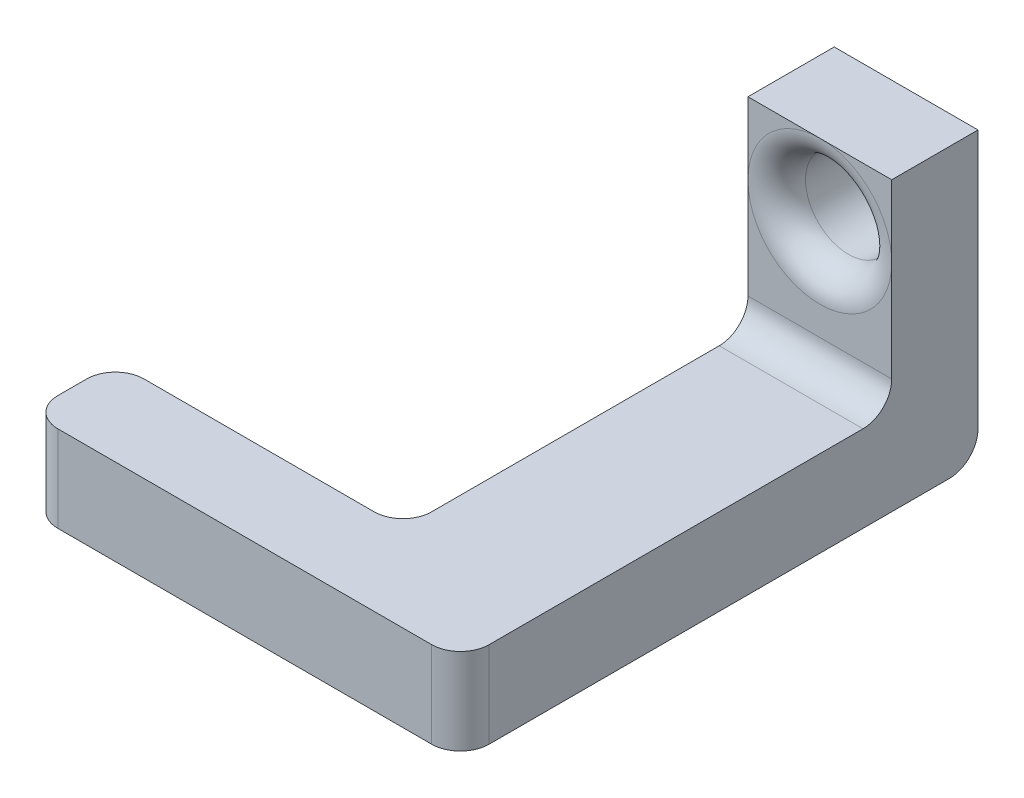
ISO-10303-21;
HEADER;
FILE_DESCRIPTION(('STEP AP214'),'2;1');
FILE_NAME('part.step','',(''),(''),'','','');
FILE_SCHEMA(('AUTOMOTIVE_DESIGN { 1 0 10303 214 1 1 1 1 }'));
ENDSEC;
DATA;
#1=APPLICATION_CONTEXT('core data for automotive mechanical design processes');
#2=APPLICATION_PROTOCOL_DEFINITION('international standard','automotive_design',2000,#1);
#3=PRODUCT_CONTEXT('',#1,'mechanical');
#4=PRODUCT('Part','Part','',(#3));
#5=PRODUCT_RELATED_PRODUCT_CATEGORY('part','',(#4));
#6=PRODUCT_DEFINITION_FORMATION('','',#4);
#7=PRODUCT_DEFINITION_CONTEXT('part definition',#1,'design');
#8=PRODUCT_DEFINITION('design','',#6,#7);
#9=PRODUCT_DEFINITION_SHAPE('','',#8);
#10=(LENGTH_UNIT() NAMED_UNIT(*) SI_UNIT(.MILLI.,.METRE.));
#11=(NAMED_UNIT(*) PLANE_ANGLE_UNIT() SI_UNIT($,.RADIAN.));
#12=(NAMED_UNIT(*) SI_UNIT($,.STERADIAN.) SOLID_ANGLE_UNIT());
#13=UNCERTAINTY_MEASURE_WITH_UNIT(LENGTH_MEASURE(1.E-05),#10,'distance_accuracy_value','');
#14=(GEOMETRIC_REPRESENTATION_CONTEXT(3) GLOBAL_UNCERTAINTY_ASSIGNED_CONTEXT((#13)) GLOBAL_UNIT_ASSIGNED_CONTEXT((#10,
#11,#12)) REPRESENTATION_CONTEXT('',''));
#15=CARTESIAN_POINT('',(0.,0.,0.));
#16=DIRECTION('',(0.,0.,1.));
#17=DIRECTION('',(1.,0.,0.));
#18=AXIS2_PLACEMENT_3D('',#15,#16,#17);
#19=CARTESIAN_POINT('',(0.,0.,3.));
#20=DIRECTION('',(0.,0.,1.));
#21=DIRECTION('',(1.,0.,0.));
#22=AXIS2_PLACEMENT_3D('',#19,#20,#21);
#23=PLANE('',#22);
#24=DIRECTION('',(0.,-1.,0.));
#25=VECTOR('',#24,1.);
#26=CARTESIAN_POINT('',(-6.90104166666667,8.82812499999999,3.));
#27=LINE('',#26,#25);
#28=CARTESIAN_POINT('',(-6.90104166666667,6.32812499999999,3.));
#29=VERTEX_POINT('',#28);
#30=CARTESIAN_POINT('',(-6.90104166666667,2.82812499999999,3.));
#31=VERTEX_POINT('',#30);
#32=EDGE_CURVE('E183',#29,#31,#27,.T.);
#33=ORIENTED_EDGE('',*,*,#32,.T.);
#34=DIRECTION('',(-1.,0.,0.));
#35=VECTOR('',#34,1.);
#36=CARTESIAN_POINT('',(0.,2.82812499999999,3.));
#37=LINE('',#36,#35);
#38=CARTESIAN_POINT('',(-1.90104166666667,2.82812499999999,3.));
#39=VERTEX_POINT('',#38);
#40=EDGE_CURVE('E54',#31,#39,#37,.F.);
#41=ORIENTED_EDGE('',*,*,#40,.T.);
#42=DIRECTION('',(0.,1.,0.));
#43=VECTOR('',#42,1.);
#44=CARTESIAN_POINT('',(-1.90104166666667,8.82812499999999,3.));
#45=LINE('',#44,#43);
#46=CARTESIAN_POINT('',(-1.90104166666667,6.32812499999999,3.));
#47=VERTEX_POINT('',#46);
#48=EDGE_CURVE('E152',#39,#47,#45,.T.);
#49=ORIENTED_EDGE('',*,*,#48,.T.);
#50=CARTESIAN_POINT('',(-4.40104166666667,6.32812499999999,3.));
#51=DIRECTION('',(0.,0.,1.));
#52=DIRECTION('',(1.,0.,0.));
#53=AXIS2_PLACEMENT_3D('',#50,#51,#52);
#54=CIRCLE('',#53,2.5);
#55=EDGE_CURVE('E480',#47,#29,#54,.F.);
#56=ORIENTED_EDGE('',*,*,#55,.T.);
#57=EDGE_LOOP('',(#33,#41,#49,#56));
#58=FACE_BOUND('',#57,.T.);
#59=ADVANCED_FACE('F33',(#58),#23,.T.);
#60=CARTESIAN_POINT('',(-6.90104166666667,8.82812499999999,3.));
#61=VERTEX_POINT('',#60);
#62=EDGE_CURVE('E153',#61,#29,#27,.T.);
#63=ORIENTED_EDGE('',*,*,#62,.T.);
#64=CARTESIAN_POINT('',(-4.40104166666667,6.32812499999999,3.));
#65=DIRECTION('',(0.,0.,1.));
#66=DIRECTION('',(1.,0.,0.));
#67=AXIS2_PLACEMENT_3D('',#64,#65,#66);
#68=CIRCLE('',#67,2.5);
#69=CARTESIAN_POINT('',(-4.40104166666667,8.82812499999999,3.));
#70=VERTEX_POINT('',#69);
#71=EDGE_CURVE('E482',#29,#70,#68,.F.);
#72=ORIENTED_EDGE('',*,*,#71,.T.);
#73=DIRECTION('',(-1.,0.,0.));
#74=VECTOR('',#73,1.);
#75=CARTESIAN_POINT('',(-6.90104166666667,8.82812499999999,3.));
#76=LINE('',#75,#74);
#77=EDGE_CURVE('E169',#70,#61,#76,.T.);
#78=ORIENTED_EDGE('',*,*,#77,.T.);
#79=EDGE_LOOP('',(#63,#72,#78));
#80=FACE_BOUND('',#79,.T.);
#81=ADVANCED_FACE('F311',(#80),#23,.T.);
#82=CARTESIAN_POINT('',(-6.90104166666667,8.82812499999999,3.));
#83=DIRECTION('',(1.,0.,0.));
#84=DIRECTION('',(0.,1.,0.));
#85=AXIS2_PLACEMENT_3D('',#82,#83,#84);
#86=PLANE('',#85);
#87=DIRECTION('',(0.,-1.,0.));
#88=VECTOR('',#87,1.);
#89=CARTESIAN_POINT('',(-6.90104166666667,8.82812499999999,0.));
#90=LINE('',#89,#88);
#91=CARTESIAN_POINT('',(-6.90104166666667,8.82812499999999,0.));
#92=VERTEX_POINT('',#91);
#93=CARTESIAN_POINT('',(-6.90104166666667,-0.171875000000009,0.));
#94=VERTEX_POINT('',#93);
#95=EDGE_CURVE('E177',#92,#94,#90,.T.);
#96=ORIENTED_EDGE('',*,*,#95,.T.);
#97=CARTESIAN_POINT('',(-6.90104166666667,-0.171875000000008,1.));
#98=DIRECTION('',(1.,0.,0.));
#99=DIRECTION('',(0.,1.,0.));
#100=AXIS2_PLACEMENT_3D('',#97,#98,#99);
#101=CIRCLE('',#100,1.);
#102=CARTESIAN_POINT('',(-6.90104166666667,-1.17187500000001,1.));
#103=VERTEX_POINT('',#102);
#104=EDGE_CURVE('E472',#94,#103,#101,.F.);
#105=ORIENTED_EDGE('',*,*,#104,.T.);
#106=DIRECTION('',(0.,0.,-1.));
#107=VECTOR('',#106,1.);
#108=CARTESIAN_POINT('',(-6.90104166666667,-1.17187500000001,3.));
#109=LINE('',#108,#107);
#110=CARTESIAN_POINT('',(-6.90104166666667,-1.17187500000001,14.));
#111=VERTEX_POINT('',#110);
#112=EDGE_CURVE('E186',#111,#103,#109,.T.);
#113=ORIENTED_EDGE('',*,*,#112,.F.);
#114=DIRECTION('',(0.,-1.,0.));
#115=VECTOR('',#114,1.);
#116=CARTESIAN_POINT('',(-6.90104166666667,1.82812499999999,14.));
#117=LINE('',#116,#115);
#118=CARTESIAN_POINT('',(-6.90104166666667,1.82812499999999,14.));
#119=VERTEX_POINT('',#118);
#120=EDGE_CURVE('E197',#111,#119,#117,.F.);
#121=ORIENTED_EDGE('',*,*,#120,.T.);
#122=DIRECTION('',(0.,0.,-1.));
#123=VECTOR('',#122,1.);
#124=CARTESIAN_POINT('',(-6.90104166666667,1.82812499999999,18.));
#125=LINE('',#124,#123);
#126=CARTESIAN_POINT('',(-6.90104166666667,1.82812499999999,4.));
#127=VERTEX_POINT('',#126);
#128=EDGE_CURVE('E195',#119,#127,#125,.T.);
#129=ORIENTED_EDGE('',*,*,#128,.T.);
#130=CARTESIAN_POINT('',(-6.90104166666667,2.82812499999999,4.));
#131=DIRECTION('',(1.,0.,0.));
#132=DIRECTION('',(0.,1.,0.));
#133=AXIS2_PLACEMENT_3D('',#130,#131,#132);
#134=CIRCLE('',#133,1.);
#135=EDGE_CURVE('E41',#127,#31,#134,.T.);
#136=ORIENTED_EDGE('',*,*,#135,.T.);
#137=ORIENTED_EDGE('',*,*,#32,.F.);
#138=ORIENTED_EDGE('',*,*,#62,.F.);
#139=DIRECTION('',(0.,0.,-1.));
#140=VECTOR('',#139,1.);
#141=CARTESIAN_POINT('',(-6.90104166666667,8.82812499999999,3.));
#142=LINE('',#141,#140);
#143=EDGE_CURVE('E164',#61,#92,#142,.T.);
#144=ORIENTED_EDGE('',*,*,#143,.T.);
#145=EDGE_LOOP('',(#96,#105,#113,#121,#129,#136,#137,#138,#144));
#146=FACE_BOUND('',#145,.T.);
#147=ADVANCED_FACE('F316',(#146),#86,.F.);
#148=CARTESIAN_POINT('',(-1.90104166666667,8.82812499999999,3.));
#149=VERTEX_POINT('',#148);
#150=EDGE_CURVE('E147',#149,#70,#76,.T.);
#151=ORIENTED_EDGE('',*,*,#150,.T.);
#152=CARTESIAN_POINT('',(-4.40104166666667,6.32812499999999,3.));
#153=DIRECTION('',(0.,0.,1.));
#154=DIRECTION('',(1.,0.,0.));
#155=AXIS2_PLACEMENT_3D('',#152,#153,#154);
#156=CIRCLE('',#155,2.5);
#157=EDGE_CURVE('E149',#70,#47,#156,.F.);
#158=ORIENTED_EDGE('',*,*,#157,.T.);
#159=EDGE_CURVE('E143',#47,#149,#45,.T.);
#160=ORIENTED_EDGE('',*,*,#159,.T.);
#161=EDGE_LOOP('',(#151,#158,#160));
#162=FACE_BOUND('',#161,.T.);
#163=ADVANCED_FACE('F145',(#162),#23,.T.);
#164=CARTESIAN_POINT('',(0.,0.,0.));
#165=DIRECTION('',(0.,0.,1.));
#166=DIRECTION('',(1.,0.,0.));
#167=AXIS2_PLACEMENT_3D('',#164,#165,#166);
#168=PLANE('',#167);
#169=DIRECTION('',(0.,1.,0.));
#170=VECTOR('',#169,1.);
#171=CARTESIAN_POINT('',(-1.90104166666667,8.82812499999999,0.));
#172=LINE('',#171,#170);
#173=CARTESIAN_POINT('',(-1.90104166666667,-0.171875000000009,0.));
#174=VERTEX_POINT('',#173);
#175=CARTESIAN_POINT('',(-1.90104166666667,8.82812499999999,0.));
#176=VERTEX_POINT('',#175);
#177=EDGE_CURVE('E160',#174,#176,#172,.T.);
#178=ORIENTED_EDGE('',*,*,#177,.F.);
#179=DIRECTION('',(1.,0.,0.));
#180=VECTOR('',#179,1.);
#181=CARTESIAN_POINT('',(0.,-0.171875000000008,0.));
#182=LINE('',#181,#180);
#183=EDGE_CURVE('E475',#174,#94,#182,.F.);
#184=ORIENTED_EDGE('',*,*,#183,.T.);
#185=ORIENTED_EDGE('',*,*,#95,.F.);
#186=DIRECTION('',(-1.,0.,0.));
#187=VECTOR('',#186,1.);
#188=CARTESIAN_POINT('',(-6.90104166666667,8.82812499999999,0.));
#189=LINE('',#188,#187);
#190=EDGE_CURVE('E182',#176,#92,#189,.T.);
#191=ORIENTED_EDGE('',*,*,#190,.F.);
#192=EDGE_LOOP('',(#178,#184,#185,#191));
#193=FACE_BOUND('',#192,.T.);
#194=CARTESIAN_POINT('',(-4.40104166666667,6.32812499999999,0.));
#195=DIRECTION('',(0.,0.,1.));
#196=DIRECTION('',(1.,0.,0.));
#197=AXIS2_PLACEMENT_3D('',#194,#195,#196);
#198=CIRCLE('',#197,1.5);
#199=CARTESIAN_POINT('',(-2.90104166666667,6.32812499999999,0.));
#200=VERTEX_POINT('',#199);
#201=EDGE_CURVE('E180',#200,#200,#198,.T.);
#202=ORIENTED_EDGE('',*,*,#201,.T.);
#203=EDGE_LOOP('',(#202));
#204=FACE_BOUND('',#203,.T.);
#205=ADVANCED_FACE('F321',(#193,#204),#168,.F.);
#206=CARTESIAN_POINT('',(-6.90104166666667,-1.17187500000001,3.));
#207=DIRECTION('',(0.,1.,0.));
#208=DIRECTION('',(0.,0.,1.));
#209=AXIS2_PLACEMENT_3D('',#206,#207,#208);
#210=PLANE('',#209);
#211=ORIENTED_EDGE('',*,*,#112,.T.);
#212=DIRECTION('',(1.,0.,0.));
#213=VECTOR('',#212,1.);
#214=CARTESIAN_POINT('',(-6.90104166666667,-1.17187500000001,1.));
#215=LINE('',#214,#213);
#216=CARTESIAN_POINT('',(-1.90104166666667,-1.17187500000001,1.));
#217=VERTEX_POINT('',#216);
#218=EDGE_CURVE('E481',#103,#217,#215,.T.);
#219=ORIENTED_EDGE('',*,*,#218,.T.);
#220=DIRECTION('',(0.,0.,-1.));
#221=VECTOR('',#220,1.);
#222=CARTESIAN_POINT('',(-1.90104166666667,-1.17187500000001,3.));
#223=LINE('',#222,#221);
#224=CARTESIAN_POINT('',(-1.90104166666667,-1.17187500000001,17.));
#225=VERTEX_POINT('',#224);
#226=EDGE_CURVE('E163',#225,#217,#223,.T.);
#227=ORIENTED_EDGE('',*,*,#226,.F.);
#228=CARTESIAN_POINT('',(-2.90104166666667,-1.17187500000001,17.));
#229=DIRECTION('',(0.,1.,0.));
#230=DIRECTION('',(0.,0.,1.));
#231=AXIS2_PLACEMENT_3D('',#228,#229,#230);
#232=CIRCLE('',#231,1.);
#233=CARTESIAN_POINT('',(-2.90104166666667,-1.17187500000001,18.));
#234=VERTEX_POINT('',#233);
#235=EDGE_CURVE('E276',#225,#234,#232,.F.);
#236=ORIENTED_EDGE('',*,*,#235,.T.);
#237=DIRECTION('',(1.,0.,0.));
#238=VECTOR('',#237,1.);
#239=CARTESIAN_POINT('',(-6.90104166666667,-1.17187500000001,18.));
#240=LINE('',#239,#238);
#241=CARTESIAN_POINT('',(-15.9010416666667,-1.17187500000001,18.));
#242=VERTEX_POINT('',#241);
#243=EDGE_CURVE('E231',#242,#234,#240,.T.);
#244=ORIENTED_EDGE('',*,*,#243,.F.);
#245=CARTESIAN_POINT('',(-15.9010416666667,-1.17187500000001,17.));
#246=DIRECTION('',(0.,1.,0.));
#247=DIRECTION('',(0.,0.,1.));
#248=AXIS2_PLACEMENT_3D('',#245,#246,#247);
#249=CIRCLE('',#248,1.);
#250=CARTESIAN_POINT('',(-16.9010416666667,-1.17187500000001,17.));
#251=VERTEX_POINT('',#250);
#252=EDGE_CURVE('E243',#242,#251,#249,.F.);
#253=ORIENTED_EDGE('',*,*,#252,.T.);
#254=DIRECTION('',(0.,0.,1.));
#255=VECTOR('',#254,1.);
#256=CARTESIAN_POINT('',(-16.9010416666667,-1.17187500000001,18.));
#257=LINE('',#256,#255);
#258=CARTESIAN_POINT('',(-16.9010416666667,-1.17187500000001,16.));
#259=VERTEX_POINT('',#258);
#260=EDGE_CURVE('E224',#259,#251,#257,.T.);
#261=ORIENTED_EDGE('',*,*,#260,.F.);
#262=CARTESIAN_POINT('',(-15.9010416666667,-1.17187500000001,16.));
#263=DIRECTION('',(0.,1.,0.));
#264=DIRECTION('',(0.,0.,1.));
#265=AXIS2_PLACEMENT_3D('',#262,#263,#264);
#266=CIRCLE('',#265,1.);
#267=CARTESIAN_POINT('',(-15.9010416666667,-1.17187500000001,15.));
#268=VERTEX_POINT('',#267);
#269=EDGE_CURVE('E227',#259,#268,#266,.F.);
#270=ORIENTED_EDGE('',*,*,#269,.T.);
#271=DIRECTION('',(1.,0.,0.));
#272=VECTOR('',#271,1.);
#273=CARTESIAN_POINT('',(-16.9010416666667,-1.17187500000001,15.));
#274=LINE('',#273,#272);
#275=CARTESIAN_POINT('',(-7.90104166666667,-1.17187500000001,15.));
#276=VERTEX_POINT('',#275);
#277=EDGE_CURVE('E220',#268,#276,#274,.T.);
#278=ORIENTED_EDGE('',*,*,#277,.T.);
#279=CARTESIAN_POINT('',(-7.90104166666667,-1.17187500000001,14.));
#280=DIRECTION('',(0.,1.,0.));
#281=DIRECTION('',(0.,0.,1.));
#282=AXIS2_PLACEMENT_3D('',#279,#280,#281);
#283=CIRCLE('',#282,1.);
#284=EDGE_CURVE('E199',#276,#111,#283,.T.);
#285=ORIENTED_EDGE('',*,*,#284,.T.);
#286=EDGE_LOOP('',(#211,#219,#227,#236,#244,#253,#261,#270,#278,#285));
#287=FACE_BOUND('',#286,.T.);
#288=ADVANCED_FACE('F296',(#287),#210,.F.);
#289=CARTESIAN_POINT('',(-1.90104166666667,8.82812499999999,3.));
#290=DIRECTION('',(-1.,0.,0.));
#291=DIRECTION('',(0.,-1.,0.));
#292=AXIS2_PLACEMENT_3D('',#289,#290,#291);
#293=PLANE('',#292);
#294=ORIENTED_EDGE('',*,*,#226,.T.);
#295=CARTESIAN_POINT('',(-1.90104166666667,-0.171875000000008,1.));
#296=DIRECTION('',(-1.,0.,0.));
#297=DIRECTION('',(0.,-1.,0.));
#298=AXIS2_PLACEMENT_3D('',#295,#296,#297);
#299=CIRCLE('',#298,1.);
#300=EDGE_CURVE('E490',#217,#174,#299,.F.);
#301=ORIENTED_EDGE('',*,*,#300,.T.);
#302=ORIENTED_EDGE('',*,*,#177,.T.);
#303=DIRECTION('',(0.,0.,-1.));
#304=VECTOR('',#303,1.);
#305=CARTESIAN_POINT('',(-1.90104166666667,8.82812499999999,3.));
#306=LINE('',#305,#304);
#307=EDGE_CURVE('E156',#149,#176,#306,.T.);
#308=ORIENTED_EDGE('',*,*,#307,.F.);
#309=ORIENTED_EDGE('',*,*,#159,.F.);
#310=ORIENTED_EDGE('',*,*,#48,.F.);
#311=CARTESIAN_POINT('',(-1.90104166666667,2.82812499999999,4.));
#312=DIRECTION('',(-1.,0.,0.));
#313=DIRECTION('',(0.,-1.,0.));
#314=AXIS2_PLACEMENT_3D('',#311,#312,#313);
#315=CIRCLE('',#314,1.);
#316=CARTESIAN_POINT('',(-1.90104166666667,1.82812499999999,4.));
#317=VERTEX_POINT('',#316);
#318=EDGE_CURVE('E11',#39,#317,#315,.T.);
#319=ORIENTED_EDGE('',*,*,#318,.T.);
#320=DIRECTION('',(0.,0.,-1.));
#321=VECTOR('',#320,1.);
#322=CARTESIAN_POINT('',(-1.90104166666667,1.82812499999999,18.));
#323=LINE('',#322,#321);
#324=CARTESIAN_POINT('',(-1.90104166666667,1.82812499999999,17.));
#325=VERTEX_POINT('',#324);
#326=EDGE_CURVE('E208',#325,#317,#323,.T.);
#327=ORIENTED_EDGE('',*,*,#326,.F.);
#328=DIRECTION('',(0.,1.,0.));
#329=VECTOR('',#328,1.);
#330=CARTESIAN_POINT('',(-1.90104166666667,8.82812499999999,17.));
#331=LINE('',#330,#329);
#332=EDGE_CURVE('E278',#325,#225,#331,.F.);
#333=ORIENTED_EDGE('',*,*,#332,.T.);
#334=EDGE_LOOP('',(#294,#301,#302,#308,#309,#310,#319,#327,#333));
#335=FACE_BOUND('',#334,.T.);
#336=ADVANCED_FACE('F158',(#335),#293,.F.);
#337=CARTESIAN_POINT('',(-6.90104166666667,8.82812499999999,3.));
#338=DIRECTION('',(0.,-1.,0.));
#339=DIRECTION('',(0.,0.,-1.));
#340=AXIS2_PLACEMENT_3D('',#337,#338,#339);
#341=PLANE('',#340);
#342=ORIENTED_EDGE('',*,*,#190,.T.);
#343=ORIENTED_EDGE('',*,*,#143,.F.);
#344=ORIENTED_EDGE('',*,*,#77,.F.);
#345=ORIENTED_EDGE('',*,*,#150,.F.);
#346=ORIENTED_EDGE('',*,*,#307,.T.);
#347=EDGE_LOOP('',(#342,#343,#344,#345,#346));
#348=FACE_BOUND('',#347,.T.);
#349=ADVANCED_FACE('F167',(#348),#341,.F.);
#350=CARTESIAN_POINT('',(-4.40104166666667,6.32812499999999,3.));
#351=DIRECTION('',(0.,0.,-1.));
#352=DIRECTION('',(-1.,0.,0.));
#353=AXIS2_PLACEMENT_3D('',#350,#351,#352);
#354=CYLINDRICAL_SURFACE('',#353,1.5);
#355=CARTESIAN_POINT('',(-4.40104166666667,6.32812499999999,2.));
#356=DIRECTION('',(0.,0.,1.));
#357=DIRECTION('',(1.,0.,0.));
#358=AXIS2_PLACEMENT_3D('',#355,#356,#357);
#359=CIRCLE('',#358,1.5);
#360=CARTESIAN_POINT('',(-2.90104166666667,6.32812499999999,2.));
#361=VERTEX_POINT('',#360);
#362=EDGE_CURVE('E245',#361,#361,#359,.T.);
#363=ORIENTED_EDGE('',*,*,#362,.T.);
#364=EDGE_LOOP('',(#363));
#365=FACE_BOUND('',#364,.T.);
#366=ORIENTED_EDGE('',*,*,#201,.F.);
#367=EDGE_LOOP('',(#366));
#368=FACE_BOUND('',#367,.T.);
#369=ADVANCED_FACE('F396',(#365,#368),#354,.F.);
#370=CARTESIAN_POINT('',(-6.90104166666667,1.82812499999999,18.));
#371=DIRECTION('',(0.,-1.,0.));
#372=DIRECTION('',(0.,0.,-1.));
#373=AXIS2_PLACEMENT_3D('',#370,#371,#372);
#374=PLANE('',#373);
#375=ORIENTED_EDGE('',*,*,#326,.T.);
#376=DIRECTION('',(-1.,0.,0.));
#377=VECTOR('',#376,1.);
#378=CARTESIAN_POINT('',(-6.90104166666667,1.82812499999999,4.));
#379=LINE('',#378,#377);
#380=EDGE_CURVE('E470',#317,#127,#379,.T.);
#381=ORIENTED_EDGE('',*,*,#380,.T.);
#382=ORIENTED_EDGE('',*,*,#128,.F.);
#383=CARTESIAN_POINT('',(-7.90104166666667,1.82812499999999,14.));
#384=DIRECTION('',(0.,-1.,0.));
#385=DIRECTION('',(0.,0.,-1.));
#386=AXIS2_PLACEMENT_3D('',#383,#384,#385);
#387=CIRCLE('',#386,1.);
#388=CARTESIAN_POINT('',(-7.90104166666667,1.82812499999999,15.));
#389=VERTEX_POINT('',#388);
#390=EDGE_CURVE('E201',#119,#389,#387,.T.);
#391=ORIENTED_EDGE('',*,*,#390,.T.);
#392=DIRECTION('',(1.,0.,0.));
#393=VECTOR('',#392,1.);
#394=CARTESIAN_POINT('',(-16.9010416666667,1.82812499999999,15.));
#395=LINE('',#394,#393);
#396=CARTESIAN_POINT('',(-15.9010416666667,1.82812499999999,15.));
#397=VERTEX_POINT('',#396);
#398=EDGE_CURVE('E223',#397,#389,#395,.T.);
#399=ORIENTED_EDGE('',*,*,#398,.F.);
#400=CARTESIAN_POINT('',(-15.9010416666667,1.82812499999999,16.));
#401=DIRECTION('',(0.,-1.,0.));
#402=DIRECTION('',(0.,0.,-1.));
#403=AXIS2_PLACEMENT_3D('',#400,#401,#402);
#404=CIRCLE('',#403,1.);
#405=CARTESIAN_POINT('',(-16.9010416666667,1.82812499999999,16.));
#406=VERTEX_POINT('',#405);
#407=EDGE_CURVE('E233',#397,#406,#404,.F.);
#408=ORIENTED_EDGE('',*,*,#407,.T.);
#409=DIRECTION('',(0.,0.,-1.));
#410=VECTOR('',#409,1.);
#411=CARTESIAN_POINT('',(-16.9010416666667,1.82812499999999,18.));
#412=LINE('',#411,#410);
#413=CARTESIAN_POINT('',(-16.9010416666667,1.82812499999999,17.));
#414=VERTEX_POINT('',#413);
#415=EDGE_CURVE('E261',#414,#406,#412,.T.);
#416=ORIENTED_EDGE('',*,*,#415,.F.);
#417=CARTESIAN_POINT('',(-15.9010416666667,1.82812499999999,17.));
#418=DIRECTION('',(0.,-1.,0.));
#419=DIRECTION('',(0.,0.,-1.));
#420=AXIS2_PLACEMENT_3D('',#417,#418,#419);
#421=CIRCLE('',#420,1.);
#422=CARTESIAN_POINT('',(-15.9010416666667,1.82812499999999,18.));
#423=VERTEX_POINT('',#422);
#424=EDGE_CURVE('E239',#414,#423,#421,.F.);
#425=ORIENTED_EDGE('',*,*,#424,.T.);
#426=DIRECTION('',(-1.,0.,0.));
#427=VECTOR('',#426,1.);
#428=CARTESIAN_POINT('',(-6.90104166666667,1.82812499999999,18.));
#429=LINE('',#428,#427);
#430=CARTESIAN_POINT('',(-2.90104166666667,1.82812499999999,18.));
#431=VERTEX_POINT('',#430);
#432=EDGE_CURVE('E255',#431,#423,#429,.T.);
#433=ORIENTED_EDGE('',*,*,#432,.F.);
#434=CARTESIAN_POINT('',(-2.90104166666667,1.82812499999999,17.));
#435=DIRECTION('',(0.,-1.,0.));
#436=DIRECTION('',(0.,0.,-1.));
#437=AXIS2_PLACEMENT_3D('',#434,#435,#436);
#438=CIRCLE('',#437,1.);
#439=EDGE_CURVE('E207',#431,#325,#438,.F.);
#440=ORIENTED_EDGE('',*,*,#439,.T.);
#441=EDGE_LOOP('',(#375,#381,#382,#391,#399,#408,#416,#425,#433,#440));
#442=FACE_BOUND('',#441,.T.);
#443=ADVANCED_FACE('F272',(#442),#374,.F.);
#444=CARTESIAN_POINT('',(0.,0.,18.));
#445=DIRECTION('',(0.,0.,-1.));
#446=DIRECTION('',(-1.,0.,0.));
#447=AXIS2_PLACEMENT_3D('',#444,#445,#446);
#448=PLANE('',#447);
#449=ORIENTED_EDGE('',*,*,#432,.T.);
#450=DIRECTION('',(0.,1.,0.));
#451=VECTOR('',#450,1.);
#452=CARTESIAN_POINT('',(-15.9010416666667,0.,18.));
#453=LINE('',#452,#451);
#454=EDGE_CURVE('E241',#423,#242,#453,.F.);
#455=ORIENTED_EDGE('',*,*,#454,.T.);
#456=ORIENTED_EDGE('',*,*,#243,.T.);
#457=DIRECTION('',(0.,1.,0.));
#458=VECTOR('',#457,1.);
#459=CARTESIAN_POINT('',(-2.90104166666667,0.,18.));
#460=LINE('',#459,#458);
#461=EDGE_CURVE('E204',#234,#431,#460,.T.);
#462=ORIENTED_EDGE('',*,*,#461,.T.);
#463=EDGE_LOOP('',(#449,#455,#456,#462));
#464=FACE_BOUND('',#463,.T.);
#465=ADVANCED_FACE('F293',(#464),#448,.F.);
#466=CARTESIAN_POINT('',(-16.9010416666667,1.82812499999999,15.));
#467=DIRECTION('',(0.,0.,1.));
#468=DIRECTION('',(1.,0.,0.));
#469=AXIS2_PLACEMENT_3D('',#466,#467,#468);
#470=PLANE('',#469);
#471=ORIENTED_EDGE('',*,*,#277,.F.);
#472=DIRECTION('',(0.,-1.,0.));
#473=VECTOR('',#472,1.);
#474=CARTESIAN_POINT('',(-15.9010416666667,1.82812499999999,15.));
#475=LINE('',#474,#473);
#476=EDGE_CURVE('E229',#268,#397,#475,.F.);
#477=ORIENTED_EDGE('',*,*,#476,.T.);
#478=ORIENTED_EDGE('',*,*,#398,.T.);
#479=DIRECTION('',(0.,-1.,0.));
#480=VECTOR('',#479,1.);
#481=CARTESIAN_POINT('',(-7.90104166666667,-1.17187500000001,15.));
#482=LINE('',#481,#480);
#483=EDGE_CURVE('E194',#389,#276,#482,.T.);
#484=ORIENTED_EDGE('',*,*,#483,.T.);
#485=EDGE_LOOP('',(#471,#477,#478,#484));
#486=FACE_BOUND('',#485,.T.);
#487=ADVANCED_FACE('F354',(#486),#470,.F.);
#488=CARTESIAN_POINT('',(-16.9010416666667,0.,0.));
#489=DIRECTION('',(1.,0.,0.));
#490=DIRECTION('',(0.,0.,-1.));
#491=AXIS2_PLACEMENT_3D('',#488,#489,#490);
#492=PLANE('',#491);
#493=ORIENTED_EDGE('',*,*,#260,.T.);
#494=DIRECTION('',(0.,1.,0.));
#495=VECTOR('',#494,1.);
#496=CARTESIAN_POINT('',(-16.9010416666667,0.,17.));
#497=LINE('',#496,#495);
#498=EDGE_CURVE('E236',#251,#414,#497,.T.);
#499=ORIENTED_EDGE('',*,*,#498,.T.);
#500=ORIENTED_EDGE('',*,*,#415,.T.);
#501=DIRECTION('',(0.,-1.,0.));
#502=VECTOR('',#501,1.);
#503=CARTESIAN_POINT('',(-16.9010416666667,0.,16.));
#504=LINE('',#503,#502);
#505=EDGE_CURVE('E225',#406,#259,#504,.T.);
#506=ORIENTED_EDGE('',*,*,#505,.T.);
#507=EDGE_LOOP('',(#493,#499,#500,#506));
#508=FACE_BOUND('',#507,.T.);
#509=ADVANCED_FACE('F265',(#508),#492,.F.);
#510=CARTESIAN_POINT('',(-7.90104166666667,1.82812499999999,14.));
#511=DIRECTION('',(0.,1.,0.));
#512=DIRECTION('',(-1.,0.,0.));
#513=AXIS2_PLACEMENT_3D('',#510,#511,#512);
#514=CYLINDRICAL_SURFACE('',#513,1.);
#515=ORIENTED_EDGE('',*,*,#390,.F.);
#516=ORIENTED_EDGE('',*,*,#120,.F.);
#517=ORIENTED_EDGE('',*,*,#284,.F.);
#518=ORIENTED_EDGE('',*,*,#483,.F.);
#519=EDGE_LOOP('',(#515,#516,#517,#518));
#520=FACE_BOUND('',#519,.T.);
#521=ADVANCED_FACE('F333',(#520),#514,.F.);
#522=CARTESIAN_POINT('',(-2.90104166666667,0.,17.));
#523=DIRECTION('',(0.,1.,0.));
#524=DIRECTION('',(-1.,0.,0.));
#525=AXIS2_PLACEMENT_3D('',#522,#523,#524);
#526=CYLINDRICAL_SURFACE('',#525,1.);
#527=ORIENTED_EDGE('',*,*,#235,.F.);
#528=ORIENTED_EDGE('',*,*,#332,.F.);
#529=ORIENTED_EDGE('',*,*,#439,.F.);
#530=ORIENTED_EDGE('',*,*,#461,.F.);
#531=EDGE_LOOP('',(#527,#528,#529,#530));
#532=FACE_BOUND('',#531,.T.);
#533=ADVANCED_FACE('F291',(#532),#526,.T.);
#534=CARTESIAN_POINT('',(-15.9010416666667,0.,16.));
#535=DIRECTION('',(0.,-1.,0.));
#536=DIRECTION('',(0.,0.,-1.));
#537=AXIS2_PLACEMENT_3D('',#534,#535,#536);
#538=CYLINDRICAL_SURFACE('',#537,1.);
#539=ORIENTED_EDGE('',*,*,#407,.F.);
#540=ORIENTED_EDGE('',*,*,#476,.F.);
#541=ORIENTED_EDGE('',*,*,#269,.F.);
#542=ORIENTED_EDGE('',*,*,#505,.F.);
#543=EDGE_LOOP('',(#539,#540,#541,#542));
#544=FACE_BOUND('',#543,.T.);
#545=ADVANCED_FACE('F275',(#544),#538,.T.);
#546=CARTESIAN_POINT('',(-15.9010416666667,0.,17.));
#547=DIRECTION('',(0.,1.,0.));
#548=DIRECTION('',(0.,0.,1.));
#549=AXIS2_PLACEMENT_3D('',#546,#547,#548);
#550=CYLINDRICAL_SURFACE('',#549,1.);
#551=ORIENTED_EDGE('',*,*,#252,.F.);
#552=ORIENTED_EDGE('',*,*,#454,.F.);
#553=ORIENTED_EDGE('',*,*,#424,.F.);
#554=ORIENTED_EDGE('',*,*,#498,.F.);
#555=EDGE_LOOP('',(#551,#552,#553,#554));
#556=FACE_BOUND('',#555,.T.);
#557=ADVANCED_FACE('F298',(#556),#550,.T.);
#558=CARTESIAN_POINT('',(-4.40104166666667,6.32812499999999,2.));
#559=DIRECTION('',(0.,0.,1.));
#560=DIRECTION('',(1.,0.,0.));
#561=AXIS2_PLACEMENT_3D('',#558,#559,#560);
#562=TOROIDAL_SURFACE('',#561,2.5,1.);
#563=ORIENTED_EDGE('',*,*,#71,.F.);
#564=ORIENTED_EDGE('',*,*,#55,.F.);
#565=ORIENTED_EDGE('',*,*,#157,.F.);
#566=EDGE_LOOP('',(#563,#564,#565));
#567=FACE_BOUND('',#566,.T.);
#568=ORIENTED_EDGE('',*,*,#362,.F.);
#569=EDGE_LOOP('',(#568));
#570=FACE_BOUND('',#569,.T.);
#571=ADVANCED_FACE('F300',(#567,#570),#562,.T.);
#572=CARTESIAN_POINT('',(-6.90104166666667,-0.171875000000008,1.));
#573=DIRECTION('',(1.,0.,0.));
#574=DIRECTION('',(0.,0.,-1.));
#575=AXIS2_PLACEMENT_3D('',#572,#573,#574);
#576=CYLINDRICAL_SURFACE('',#575,1.);
#577=ORIENTED_EDGE('',*,*,#104,.F.);
#578=ORIENTED_EDGE('',*,*,#183,.F.);
#579=ORIENTED_EDGE('',*,*,#300,.F.);
#580=ORIENTED_EDGE('',*,*,#218,.F.);
#581=EDGE_LOOP('',(#577,#578,#579,#580));
#582=FACE_BOUND('',#581,.T.);
#583=ADVANCED_FACE('F306',(#582),#576,.T.);
#584=CARTESIAN_POINT('',(-6.90104166666667,2.82812499999999,4.));
#585=DIRECTION('',(-1.,0.,0.));
#586=DIRECTION('',(0.,0.,1.));
#587=AXIS2_PLACEMENT_3D('',#584,#585,#586);
#588=CYLINDRICAL_SURFACE('',#587,1.);
#589=ORIENTED_EDGE('',*,*,#318,.F.);
#590=ORIENTED_EDGE('',*,*,#40,.F.);
#591=ORIENTED_EDGE('',*,*,#135,.F.);
#592=ORIENTED_EDGE('',*,*,#380,.F.);
#593=EDGE_LOOP('',(#589,#590,#591,#592));
#594=FACE_BOUND('',#593,.T.);
#595=ADVANCED_FACE('F35',(#594),#588,.F.);
#596=CLOSED_SHELL('',(#59,#81,#147,#163,#205,#288,#336,#349,#369,#443,#465,#487,#509,#521,#533,
#545,#557,#571,#583,#595));
#597=MANIFOLD_SOLID_BREP('B2',#596);
#598=ADVANCED_BREP_SHAPE_REPRESENTATION('',(#18,#597),#14);
#599=SHAPE_DEFINITION_REPRESENTATION(#9,#598);
ENDSEC;
END-ISO-10303-21;
